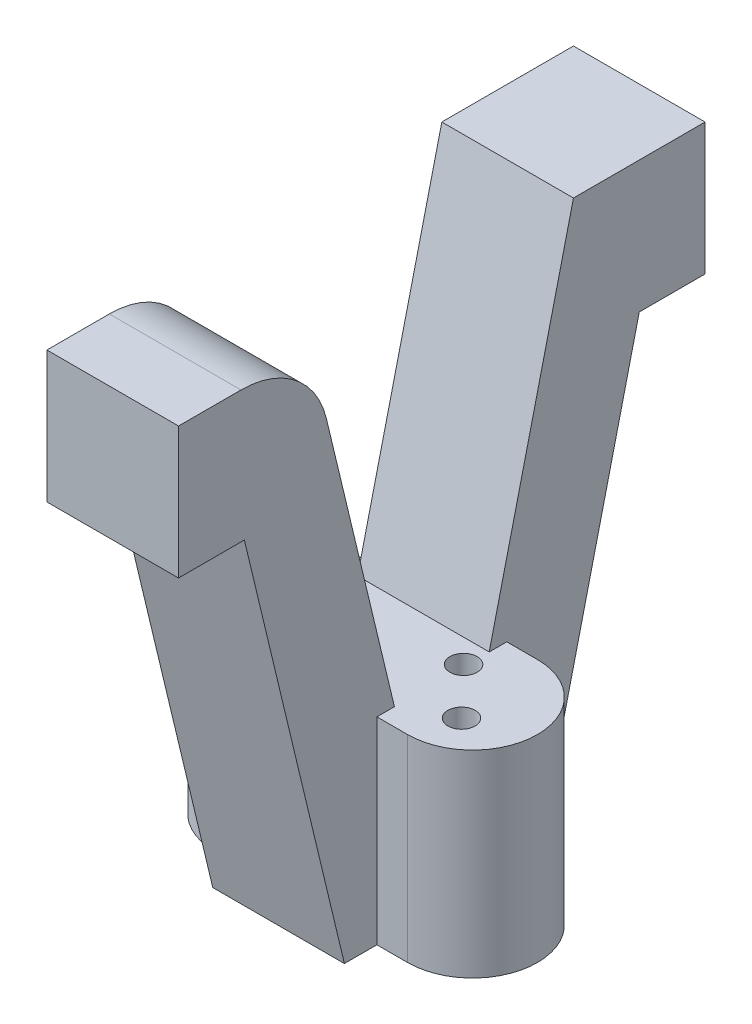
ISO-10303-21;
HEADER;
FILE_DESCRIPTION(('STEP AP214'),'2;1');
FILE_NAME('part.step','',(''),(''),'','','');
FILE_SCHEMA(('AUTOMOTIVE_DESIGN { 1 0 10303 214 1 1 1 1 }'));
ENDSEC;
DATA;
#1=APPLICATION_CONTEXT('core data for automotive mechanical design processes');
#2=APPLICATION_PROTOCOL_DEFINITION('international standard','automotive_design',2000,#1);
#3=PRODUCT_CONTEXT('',#1,'mechanical');
#4=PRODUCT('Part','Part','',(#3));
#5=PRODUCT_RELATED_PRODUCT_CATEGORY('part','',(#4));
#6=PRODUCT_DEFINITION_FORMATION('','',#4);
#7=PRODUCT_DEFINITION_CONTEXT('part definition',#1,'design');
#8=PRODUCT_DEFINITION('design','',#6,#7);
#9=PRODUCT_DEFINITION_SHAPE('','',#8);
#10=(LENGTH_UNIT() NAMED_UNIT(*) SI_UNIT(.MILLI.,.METRE.));
#11=(NAMED_UNIT(*) PLANE_ANGLE_UNIT() SI_UNIT($,.RADIAN.));
#12=(NAMED_UNIT(*) SI_UNIT($,.STERADIAN.) SOLID_ANGLE_UNIT());
#13=UNCERTAINTY_MEASURE_WITH_UNIT(LENGTH_MEASURE(1.E-05),#10,'distance_accuracy_value','');
#14=(GEOMETRIC_REPRESENTATION_CONTEXT(3) GLOBAL_UNCERTAINTY_ASSIGNED_CONTEXT((#13)) GLOBAL_UNIT_ASSIGNED_CONTEXT((#10,
#11,#12)) REPRESENTATION_CONTEXT('',''));
#15=CARTESIAN_POINT('',(0.,0.,0.));
#16=DIRECTION('',(0.,0.,1.));
#17=DIRECTION('',(1.,0.,0.));
#18=AXIS2_PLACEMENT_3D('',#15,#16,#17);
#19=CARTESIAN_POINT('',(-2.2,4.5,-1.48));
#20=DIRECTION('',(0.,0.,-1.));
#21=DIRECTION('',(-1.,0.,0.));
#22=AXIS2_PLACEMENT_3D('',#19,#20,#21);
#23=PLANE('',#22);
#24=DIRECTION('',(1.,0.,0.));
#25=VECTOR('',#24,1.);
#26=CARTESIAN_POINT('',(-2.2,0.,-1.48));
#27=LINE('',#26,#25);
#28=CARTESIAN_POINT('',(1.5,0.,-1.48));
#29=VERTEX_POINT('',#28);
#30=CARTESIAN_POINT('',(2.2,0.,-1.48));
#31=VERTEX_POINT('',#30);
#32=EDGE_CURVE('E265',#29,#31,#27,.T.);
#33=ORIENTED_EDGE('',*,*,#32,.F.);
#34=DIRECTION('',(0.,1.,0.));
#35=VECTOR('',#34,1.);
#36=CARTESIAN_POINT('',(1.5,4.5,-1.48));
#37=LINE('',#36,#35);
#38=CARTESIAN_POINT('',(1.5,4.5,-1.48));
#39=VERTEX_POINT('',#38);
#40=EDGE_CURVE('E229',#29,#39,#37,.T.);
#41=ORIENTED_EDGE('',*,*,#40,.T.);
#42=DIRECTION('',(1.,0.,0.));
#43=VECTOR('',#42,1.);
#44=CARTESIAN_POINT('',(-2.2,4.5,-1.48));
#45=LINE('',#44,#43);
#46=CARTESIAN_POINT('',(2.2,4.5,-1.48));
#47=VERTEX_POINT('',#46);
#48=EDGE_CURVE('E251',#39,#47,#45,.T.);
#49=ORIENTED_EDGE('',*,*,#48,.T.);
#50=DIRECTION('',(0.,-1.,0.));
#51=VECTOR('',#50,1.);
#52=CARTESIAN_POINT('',(2.2,4.5,-1.48));
#53=LINE('',#52,#51);
#54=EDGE_CURVE('E269',#47,#31,#53,.T.);
#55=ORIENTED_EDGE('',*,*,#54,.T.);
#56=EDGE_LOOP('',(#33,#41,#49,#55));
#57=FACE_BOUND('',#56,.T.);
#58=ADVANCED_FACE('F33',(#57),#23,.T.);
#59=CARTESIAN_POINT('',(-1.5,0.,0.));
#60=DIRECTION('',(-1.,0.,0.));
#61=DIRECTION('',(0.,0.,1.));
#62=AXIS2_PLACEMENT_3D('',#59,#60,#61);
#63=PLANE('',#62);
#64=DIRECTION('',(0.,0.,-1.));
#65=VECTOR('',#64,1.);
#66=CARTESIAN_POINT('',(-1.5,4.5,0.));
#67=LINE('',#66,#65);
#68=CARTESIAN_POINT('',(-1.5,4.5,1.48));
#69=VERTEX_POINT('',#68);
#70=CARTESIAN_POINT('',(-1.5,4.5,1.08));
#71=VERTEX_POINT('',#70);
#72=EDGE_CURVE('E58',#69,#71,#67,.T.);
#73=ORIENTED_EDGE('',*,*,#72,.F.);
#74=DIRECTION('',(0.,-1.,0.));
#75=VECTOR('',#74,1.);
#76=CARTESIAN_POINT('',(-1.5,0.,1.48));
#77=LINE('',#76,#75);
#78=CARTESIAN_POINT('',(-1.5,0.,1.48));
#79=VERTEX_POINT('',#78);
#80=EDGE_CURVE('E282',#69,#79,#77,.T.);
#81=ORIENTED_EDGE('',*,*,#80,.T.);
#82=DIRECTION('',(0.,0.,-1.));
#83=VECTOR('',#82,1.);
#84=CARTESIAN_POINT('',(-1.5,0.,0.));
#85=LINE('',#84,#83);
#86=CARTESIAN_POINT('',(-1.5,0.,2.22));
#87=VERTEX_POINT('',#86);
#88=EDGE_CURVE('E310',#87,#79,#85,.T.);
#89=ORIENTED_EDGE('',*,*,#88,.F.);
#90=DIRECTION('',(0.,-0.972387301980517,-0.233372952475324));
#91=VECTOR('',#90,1.);
#92=CARTESIAN_POINT('',(-1.5,0.,2.22));
#93=LINE('',#92,#91);
#94=CARTESIAN_POINT('',(-1.5,9.5,4.5));
#95=VERTEX_POINT('',#94);
#96=EDGE_CURVE('E307',#95,#87,#93,.T.);
#97=ORIENTED_EDGE('',*,*,#96,.F.);
#98=DIRECTION('',(0.,0.,-1.));
#99=VECTOR('',#98,1.);
#100=CARTESIAN_POINT('',(-1.5,9.5,6.));
#101=LINE('',#100,#99);
#102=CARTESIAN_POINT('',(-1.5,9.5,6.));
#103=VERTEX_POINT('',#102);
#104=EDGE_CURVE('E304',#103,#95,#101,.T.);
#105=ORIENTED_EDGE('',*,*,#104,.F.);
#106=DIRECTION('',(0.,-1.,0.));
#107=VECTOR('',#106,1.);
#108=CARTESIAN_POINT('',(-1.5,12.5,6.));
#109=LINE('',#108,#107);
#110=CARTESIAN_POINT('',(-1.5,12.5,6.));
#111=VERTEX_POINT('',#110);
#112=EDGE_CURVE('E301',#111,#103,#109,.T.);
#113=ORIENTED_EDGE('',*,*,#112,.F.);
#114=DIRECTION('',(0.,0.,1.));
#115=VECTOR('',#114,1.);
#116=CARTESIAN_POINT('',(-1.5,12.5,6.));
#117=LINE('',#116,#115);
#118=CARTESIAN_POINT('',(-1.5,12.5,4.57679362114919));
#119=VERTEX_POINT('',#118);
#120=EDGE_CURVE('E299',#119,#111,#117,.T.);
#121=ORIENTED_EDGE('',*,*,#120,.F.);
#122=CARTESIAN_POINT('',(-1.5,10.5,4.57679362114919));
#123=DIRECTION('',(-1.,0.,0.));
#124=DIRECTION('',(0.,0.,1.));
#125=AXIS2_PLACEMENT_3D('',#122,#123,#124);
#126=CIRCLE('',#125,2.);
#127=CARTESIAN_POINT('',(-1.5,10.9667459049506,2.63201901718816));
#128=VERTEX_POINT('',#127);
#129=EDGE_CURVE('E331',#119,#128,#126,.T.);
#130=ORIENTED_EDGE('',*,*,#129,.T.);
#131=DIRECTION('',(0.,0.972387301980517,0.233372952475324));
#132=VECTOR('',#131,1.);
#133=CARTESIAN_POINT('',(-1.5,12.5,3.));
#134=LINE('',#133,#132);
#135=EDGE_CURVE('E313',#71,#128,#134,.T.);
#136=ORIENTED_EDGE('',*,*,#135,.F.);
#137=EDGE_LOOP('',(#73,#81,#89,#97,#105,#113,#121,#130,#136));
#138=FACE_BOUND('',#137,.T.);
#139=ADVANCED_FACE('F379',(#138),#63,.T.);
#140=CARTESIAN_POINT('',(1.5,0.,0.));
#141=DIRECTION('',(-1.,0.,0.));
#142=DIRECTION('',(0.,0.,1.));
#143=AXIS2_PLACEMENT_3D('',#140,#141,#142);
#144=PLANE('',#143);
#145=DIRECTION('',(0.,-1.,0.));
#146=VECTOR('',#145,1.);
#147=CARTESIAN_POINT('',(1.5,0.,1.48));
#148=LINE('',#147,#146);
#149=CARTESIAN_POINT('',(1.5,4.5,1.48));
#150=VERTEX_POINT('',#149);
#151=CARTESIAN_POINT('',(1.5,0.,1.48));
#152=VERTEX_POINT('',#151);
#153=EDGE_CURVE('E336',#150,#152,#148,.T.);
#154=ORIENTED_EDGE('',*,*,#153,.F.);
#155=DIRECTION('',(0.,0.,-1.));
#156=VECTOR('',#155,1.);
#157=CARTESIAN_POINT('',(1.5,4.5,0.));
#158=LINE('',#157,#156);
#159=CARTESIAN_POINT('',(1.5,4.5,1.08));
#160=VERTEX_POINT('',#159);
#161=EDGE_CURVE('E334',#150,#160,#158,.T.);
#162=ORIENTED_EDGE('',*,*,#161,.T.);
#163=DIRECTION('',(0.,0.972387301980517,0.233372952475324));
#164=VECTOR('',#163,1.);
#165=CARTESIAN_POINT('',(1.5,12.5,3.));
#166=LINE('',#165,#164);
#167=CARTESIAN_POINT('',(1.5,10.9667459049506,2.63201901718816));
#168=VERTEX_POINT('',#167);
#169=EDGE_CURVE('E297',#160,#168,#166,.T.);
#170=ORIENTED_EDGE('',*,*,#169,.T.);
#171=CARTESIAN_POINT('',(1.5,10.5,4.57679362114919));
#172=DIRECTION('',(-1.,0.,0.));
#173=DIRECTION('',(0.,0.,1.));
#174=AXIS2_PLACEMENT_3D('',#171,#172,#173);
#175=CIRCLE('',#174,2.);
#176=CARTESIAN_POINT('',(1.5,12.5,4.57679362114919));
#177=VERTEX_POINT('',#176);
#178=EDGE_CURVE('E327',#168,#177,#175,.F.);
#179=ORIENTED_EDGE('',*,*,#178,.T.);
#180=DIRECTION('',(0.,0.,1.));
#181=VECTOR('',#180,1.);
#182=CARTESIAN_POINT('',(1.5,12.5,6.));
#183=LINE('',#182,#181);
#184=CARTESIAN_POINT('',(1.5,12.5,6.));
#185=VERTEX_POINT('',#184);
#186=EDGE_CURVE('E284',#177,#185,#183,.T.);
#187=ORIENTED_EDGE('',*,*,#186,.T.);
#188=DIRECTION('',(0.,-1.,0.));
#189=VECTOR('',#188,1.);
#190=CARTESIAN_POINT('',(1.5,12.5,6.));
#191=LINE('',#190,#189);
#192=CARTESIAN_POINT('',(1.5,9.5,6.));
#193=VERTEX_POINT('',#192);
#194=EDGE_CURVE('E286',#185,#193,#191,.T.);
#195=ORIENTED_EDGE('',*,*,#194,.T.);
#196=DIRECTION('',(0.,0.,-1.));
#197=VECTOR('',#196,1.);
#198=CARTESIAN_POINT('',(1.5,9.5,6.));
#199=LINE('',#198,#197);
#200=CARTESIAN_POINT('',(1.5,9.5,4.5));
#201=VERTEX_POINT('',#200);
#202=EDGE_CURVE('E289',#193,#201,#199,.T.);
#203=ORIENTED_EDGE('',*,*,#202,.T.);
#204=DIRECTION('',(0.,-0.972387301980517,-0.233372952475324));
#205=VECTOR('',#204,1.);
#206=CARTESIAN_POINT('',(1.5,0.,2.22));
#207=LINE('',#206,#205);
#208=CARTESIAN_POINT('',(1.5,0.,2.22));
#209=VERTEX_POINT('',#208);
#210=EDGE_CURVE('E292',#201,#209,#207,.T.);
#211=ORIENTED_EDGE('',*,*,#210,.T.);
#212=DIRECTION('',(0.,0.,-1.));
#213=VECTOR('',#212,1.);
#214=CARTESIAN_POINT('',(1.5,0.,0.));
#215=LINE('',#214,#213);
#216=EDGE_CURVE('E295',#209,#152,#215,.T.);
#217=ORIENTED_EDGE('',*,*,#216,.T.);
#218=EDGE_LOOP('',(#154,#162,#170,#179,#187,#195,#203,#211,#217));
#219=FACE_BOUND('',#218,.T.);
#220=ADVANCED_FACE('F386',(#219),#144,.F.);
#221=CARTESIAN_POINT('',(-1.5,12.5,6.));
#222=DIRECTION('',(0.,1.,0.));
#223=DIRECTION('',(0.,0.,1.));
#224=AXIS2_PLACEMENT_3D('',#221,#222,#223);
#225=PLANE('',#224);
#226=ORIENTED_EDGE('',*,*,#186,.F.);
#227=DIRECTION('',(1.,0.,0.));
#228=VECTOR('',#227,1.);
#229=CARTESIAN_POINT('',(-1.5,12.5,4.57679362114919));
#230=LINE('',#229,#228);
#231=EDGE_CURVE('E329',#177,#119,#230,.F.);
#232=ORIENTED_EDGE('',*,*,#231,.T.);
#233=ORIENTED_EDGE('',*,*,#120,.T.);
#234=DIRECTION('',(1.,0.,0.));
#235=VECTOR('',#234,1.);
#236=CARTESIAN_POINT('',(-1.5,12.5,6.));
#237=LINE('',#236,#235);
#238=EDGE_CURVE('E315',#111,#185,#237,.T.);
#239=ORIENTED_EDGE('',*,*,#238,.T.);
#240=EDGE_LOOP('',(#226,#232,#233,#239));
#241=FACE_BOUND('',#240,.T.);
#242=ADVANCED_FACE('F450',(#241),#225,.T.);
#243=CARTESIAN_POINT('',(-1.5,12.5,3.));
#244=DIRECTION('',(0.,0.233372952475324,-0.972387301980517));
#245=DIRECTION('',(0.,0.972387301980518,0.233372952475324));
#246=AXIS2_PLACEMENT_3D('',#243,#244,#245);
#247=PLANE('',#246);
#248=DIRECTION('',(1.,0.,0.));
#249=VECTOR('',#248,1.);
#250=CARTESIAN_POINT('',(-1.5,4.5,1.08));
#251=LINE('',#250,#249);
#252=EDGE_CURVE('E278',#71,#160,#251,.T.);
#253=ORIENTED_EDGE('',*,*,#252,.F.);
#254=ORIENTED_EDGE('',*,*,#135,.T.);
#255=DIRECTION('',(1.,0.,0.));
#256=VECTOR('',#255,1.);
#257=CARTESIAN_POINT('',(-1.5,10.9667459049506,2.63201901718816));
#258=LINE('',#257,#256);
#259=EDGE_CURVE('E318',#128,#168,#258,.T.);
#260=ORIENTED_EDGE('',*,*,#259,.T.);
#261=ORIENTED_EDGE('',*,*,#169,.F.);
#262=EDGE_LOOP('',(#253,#254,#260,#261));
#263=FACE_BOUND('',#262,.T.);
#264=ADVANCED_FACE('F440',(#263),#247,.T.);
#265=CARTESIAN_POINT('',(-1.5,0.,0.));
#266=DIRECTION('',(0.,-1.,0.));
#267=DIRECTION('',(0.,0.,-1.));
#268=AXIS2_PLACEMENT_3D('',#265,#266,#267);
#269=PLANE('',#268);
#270=CARTESIAN_POINT('',(-1.21081065438977,0.,0.));
#271=DIRECTION('',(0.,1.,0.));
#272=DIRECTION('',(0.,0.,1.));
#273=AXIS2_PLACEMENT_3D('',#270,#271,#272);
#274=CIRCLE('',#273,0.63);
#275=CARTESIAN_POINT('',(-1.21081065438977,0.,0.629999999999999));
#276=VERTEX_POINT('',#275);
#277=EDGE_CURVE('E344',#276,#276,#274,.T.);
#278=ORIENTED_EDGE('',*,*,#277,.T.);
#279=EDGE_LOOP('',(#278));
#280=FACE_BOUND('',#279,.T.);
#281=CARTESIAN_POINT('',(1.45353845370262,0.,-0.541981392860774));
#282=DIRECTION('',(0.,1.,0.));
#283=DIRECTION('',(0.,0.,1.));
#284=AXIS2_PLACEMENT_3D('',#281,#282,#283);
#285=CIRCLE('',#284,0.310429464597826);
#286=CARTESIAN_POINT('',(1.45353845370262,0.,-0.231551928262949));
#287=VERTEX_POINT('',#286);
#288=EDGE_CURVE('E359',#287,#287,#285,.T.);
#289=ORIENTED_EDGE('',*,*,#288,.T.);
#290=EDGE_LOOP('',(#289));
#291=FACE_BOUND('',#290,.T.);
#292=CARTESIAN_POINT('',(2.49037242265366,0.,0.541981392860775));
#293=DIRECTION('',(0.,1.,0.));
#294=DIRECTION('',(0.,0.,1.));
#295=AXIS2_PLACEMENT_3D('',#292,#293,#294);
#296=CIRCLE('',#295,0.310429464597825);
#297=CARTESIAN_POINT('',(2.49037242265366,0.,0.8524108574586));
#298=VERTEX_POINT('',#297);
#299=EDGE_CURVE('E205',#298,#298,#296,.T.);
#300=ORIENTED_EDGE('',*,*,#299,.T.);
#301=EDGE_LOOP('',(#300));
#302=FACE_BOUND('',#301,.T.);
#303=CARTESIAN_POINT('',(-2.2,0.,-1.48));
#304=VERTEX_POINT('',#303);
#305=CARTESIAN_POINT('',(-1.5,0.,-1.48));
#306=VERTEX_POINT('',#305);
#307=EDGE_CURVE('E244',#304,#306,#27,.T.);
#308=ORIENTED_EDGE('',*,*,#307,.T.);
#309=DIRECTION('',(0.,0.,1.));
#310=VECTOR('',#309,1.);
#311=CARTESIAN_POINT('',(-1.5,0.,0.));
#312=LINE('',#311,#310);
#313=CARTESIAN_POINT('',(-1.5,0.,-2.22));
#314=VERTEX_POINT('',#313);
#315=EDGE_CURVE('E220',#314,#306,#312,.T.);
#316=ORIENTED_EDGE('',*,*,#315,.F.);
#317=DIRECTION('',(1.,0.,0.));
#318=VECTOR('',#317,1.);
#319=CARTESIAN_POINT('',(-1.5,0.,-2.22));
#320=LINE('',#319,#318);
#321=CARTESIAN_POINT('',(1.5,0.,-2.22));
#322=VERTEX_POINT('',#321);
#323=EDGE_CURVE('E194',#314,#322,#320,.T.);
#324=ORIENTED_EDGE('',*,*,#323,.T.);
#325=DIRECTION('',(0.,0.,1.));
#326=VECTOR('',#325,1.);
#327=CARTESIAN_POINT('',(1.5,0.,0.));
#328=LINE('',#327,#326);
#329=EDGE_CURVE('E184',#322,#29,#328,.T.);
#330=ORIENTED_EDGE('',*,*,#329,.T.);
#331=ORIENTED_EDGE('',*,*,#32,.T.);
#332=CARTESIAN_POINT('',(2.2,0.,0.));
#333=DIRECTION('',(0.,1.,0.));
#334=DIRECTION('',(0.,0.,1.));
#335=AXIS2_PLACEMENT_3D('',#332,#333,#334);
#336=CIRCLE('',#335,1.48);
#337=CARTESIAN_POINT('',(2.2,0.,1.48));
#338=VERTEX_POINT('',#337);
#339=EDGE_CURVE('E262',#338,#31,#336,.T.);
#340=ORIENTED_EDGE('',*,*,#339,.F.);
#341=DIRECTION('',(1.,0.,0.));
#342=VECTOR('',#341,1.);
#343=CARTESIAN_POINT('',(-2.2,0.,1.48));
#344=LINE('',#343,#342);
#345=EDGE_CURVE('E258',#152,#338,#344,.T.);
#346=ORIENTED_EDGE('',*,*,#345,.F.);
#347=ORIENTED_EDGE('',*,*,#216,.F.);
#348=DIRECTION('',(1.,0.,0.));
#349=VECTOR('',#348,1.);
#350=CARTESIAN_POINT('',(-1.5,0.,2.22));
#351=LINE('',#350,#349);
#352=EDGE_CURVE('E316',#87,#209,#351,.T.);
#353=ORIENTED_EDGE('',*,*,#352,.F.);
#354=ORIENTED_EDGE('',*,*,#88,.T.);
#355=CARTESIAN_POINT('',(-2.2,0.,1.48));
#356=VERTEX_POINT('',#355);
#357=EDGE_CURVE('E259',#356,#79,#344,.T.);
#358=ORIENTED_EDGE('',*,*,#357,.F.);
#359=CARTESIAN_POINT('',(-2.2,0.,0.));
#360=DIRECTION('',(0.,1.,0.));
#361=DIRECTION('',(0.,0.,1.));
#362=AXIS2_PLACEMENT_3D('',#359,#360,#361);
#363=CIRCLE('',#362,1.48);
#364=EDGE_CURVE('E239',#304,#356,#363,.T.);
#365=ORIENTED_EDGE('',*,*,#364,.F.);
#366=EDGE_LOOP('',(#308,#316,#324,#330,#331,#340,#346,#347,#353,#354,#358,#365));
#367=FACE_BOUND('',#366,.T.);
#368=ADVANCED_FACE('F366',(#280,#291,#302,#367),#269,.T.);
#369=CARTESIAN_POINT('',(-1.5,0.,2.22));
#370=DIRECTION('',(0.,-0.233372952475324,0.972387301980517));
#371=DIRECTION('',(0.,-0.972387301980518,-0.233372952475324));
#372=AXIS2_PLACEMENT_3D('',#369,#370,#371);
#373=PLANE('',#372);
#374=ORIENTED_EDGE('',*,*,#352,.T.);
#375=ORIENTED_EDGE('',*,*,#210,.F.);
#376=DIRECTION('',(1.,0.,0.));
#377=VECTOR('',#376,1.);
#378=CARTESIAN_POINT('',(-1.5,9.5,4.5));
#379=LINE('',#378,#377);
#380=EDGE_CURVE('E319',#95,#201,#379,.T.);
#381=ORIENTED_EDGE('',*,*,#380,.F.);
#382=ORIENTED_EDGE('',*,*,#96,.T.);
#383=EDGE_LOOP('',(#374,#375,#381,#382));
#384=FACE_BOUND('',#383,.T.);
#385=ADVANCED_FACE('F462',(#384),#373,.T.);
#386=CARTESIAN_POINT('',(-1.5,9.5,6.));
#387=DIRECTION('',(0.,-1.,0.));
#388=DIRECTION('',(0.,0.,-1.));
#389=AXIS2_PLACEMENT_3D('',#386,#387,#388);
#390=PLANE('',#389);
#391=ORIENTED_EDGE('',*,*,#380,.T.);
#392=ORIENTED_EDGE('',*,*,#202,.F.);
#393=DIRECTION('',(1.,0.,0.));
#394=VECTOR('',#393,1.);
#395=CARTESIAN_POINT('',(-1.5,9.5,6.));
#396=LINE('',#395,#394);
#397=EDGE_CURVE('E321',#103,#193,#396,.T.);
#398=ORIENTED_EDGE('',*,*,#397,.F.);
#399=ORIENTED_EDGE('',*,*,#104,.T.);
#400=EDGE_LOOP('',(#391,#392,#398,#399));
#401=FACE_BOUND('',#400,.T.);
#402=ADVANCED_FACE('F458',(#401),#390,.T.);
#403=CARTESIAN_POINT('',(-1.5,12.5,6.));
#404=DIRECTION('',(0.,0.,1.));
#405=DIRECTION('',(0.,-1.,0.));
#406=AXIS2_PLACEMENT_3D('',#403,#404,#405);
#407=PLANE('',#406);
#408=ORIENTED_EDGE('',*,*,#397,.T.);
#409=ORIENTED_EDGE('',*,*,#194,.F.);
#410=ORIENTED_EDGE('',*,*,#238,.F.);
#411=ORIENTED_EDGE('',*,*,#112,.T.);
#412=EDGE_LOOP('',(#408,#409,#410,#411));
#413=FACE_BOUND('',#412,.T.);
#414=ADVANCED_FACE('F454',(#413),#407,.T.);
#415=CARTESIAN_POINT('',(-1.5,10.5,4.57679362114919));
#416=DIRECTION('',(1.,0.,0.));
#417=DIRECTION('',(0.,0.,-1.));
#418=AXIS2_PLACEMENT_3D('',#415,#416,#417);
#419=CYLINDRICAL_SURFACE('',#418,2.);
#420=ORIENTED_EDGE('',*,*,#129,.F.);
#421=ORIENTED_EDGE('',*,*,#231,.F.);
#422=ORIENTED_EDGE('',*,*,#178,.F.);
#423=ORIENTED_EDGE('',*,*,#259,.F.);
#424=EDGE_LOOP('',(#420,#421,#422,#423));
#425=FACE_BOUND('',#424,.T.);
#426=ADVANCED_FACE('F35',(#425),#419,.T.);
#427=CARTESIAN_POINT('',(-2.2,4.5,1.48));
#428=DIRECTION('',(0.,0.,-1.));
#429=DIRECTION('',(-1.,0.,0.));
#430=AXIS2_PLACEMENT_3D('',#427,#428,#429);
#431=PLANE('',#430);
#432=DIRECTION('',(1.,0.,0.));
#433=VECTOR('',#432,1.);
#434=CARTESIAN_POINT('',(-2.2,4.5,1.48));
#435=LINE('',#434,#433);
#436=CARTESIAN_POINT('',(2.2,4.5,1.48));
#437=VERTEX_POINT('',#436);
#438=EDGE_CURVE('E243',#150,#437,#435,.T.);
#439=ORIENTED_EDGE('',*,*,#438,.F.);
#440=ORIENTED_EDGE('',*,*,#153,.T.);
#441=ORIENTED_EDGE('',*,*,#345,.T.);
#442=DIRECTION('',(0.,-1.,0.));
#443=VECTOR('',#442,1.);
#444=CARTESIAN_POINT('',(2.2,4.5,1.48));
#445=LINE('',#444,#443);
#446=EDGE_CURVE('E272',#437,#338,#445,.T.);
#447=ORIENTED_EDGE('',*,*,#446,.F.);
#448=EDGE_LOOP('',(#439,#440,#441,#447));
#449=FACE_BOUND('',#448,.T.);
#450=ADVANCED_FACE('F436',(#449),#431,.F.);
#451=CARTESIAN_POINT('',(-2.2,4.5,0.));
#452=DIRECTION('',(0.,-1.,0.));
#453=DIRECTION('',(0.,0.,-1.));
#454=AXIS2_PLACEMENT_3D('',#451,#452,#453);
#455=CYLINDRICAL_SURFACE('',#454,1.48);
#456=ORIENTED_EDGE('',*,*,#364,.T.);
#457=DIRECTION('',(0.,-1.,0.));
#458=VECTOR('',#457,1.);
#459=CARTESIAN_POINT('',(-2.2,4.5,1.48));
#460=LINE('',#459,#458);
#461=CARTESIAN_POINT('',(-2.2,4.5,1.48));
#462=VERTEX_POINT('',#461);
#463=EDGE_CURVE('E275',#462,#356,#460,.T.);
#464=ORIENTED_EDGE('',*,*,#463,.F.);
#465=CARTESIAN_POINT('',(-2.2,4.5,0.));
#466=DIRECTION('',(0.,1.,0.));
#467=DIRECTION('',(0.,0.,1.));
#468=AXIS2_PLACEMENT_3D('',#465,#466,#467);
#469=CIRCLE('',#468,1.48);
#470=CARTESIAN_POINT('',(-2.2,4.5,-1.48));
#471=VERTEX_POINT('',#470);
#472=EDGE_CURVE('E240',#471,#462,#469,.T.);
#473=ORIENTED_EDGE('',*,*,#472,.F.);
#474=DIRECTION('',(0.,-1.,0.));
#475=VECTOR('',#474,1.);
#476=CARTESIAN_POINT('',(-2.2,4.5,-1.48));
#477=LINE('',#476,#475);
#478=EDGE_CURVE('E255',#471,#304,#477,.T.);
#479=ORIENTED_EDGE('',*,*,#478,.T.);
#480=EDGE_LOOP('',(#456,#464,#473,#479));
#481=FACE_BOUND('',#480,.T.);
#482=ADVANCED_FACE('F410',(#481),#455,.T.);
#483=ORIENTED_EDGE('',*,*,#80,.F.);
#484=EDGE_CURVE('E245',#462,#69,#435,.T.);
#485=ORIENTED_EDGE('',*,*,#484,.F.);
#486=ORIENTED_EDGE('',*,*,#463,.T.);
#487=ORIENTED_EDGE('',*,*,#357,.T.);
#488=EDGE_LOOP('',(#483,#485,#486,#487));
#489=FACE_BOUND('',#488,.T.);
#490=ADVANCED_FACE('F399',(#489),#431,.F.);
#491=CARTESIAN_POINT('',(2.2,4.5,0.));
#492=DIRECTION('',(0.,-1.,0.));
#493=DIRECTION('',(0.,0.,-1.));
#494=AXIS2_PLACEMENT_3D('',#491,#492,#493);
#495=CYLINDRICAL_SURFACE('',#494,1.48);
#496=ORIENTED_EDGE('',*,*,#339,.T.);
#497=ORIENTED_EDGE('',*,*,#54,.F.);
#498=CARTESIAN_POINT('',(2.2,4.5,0.));
#499=DIRECTION('',(0.,1.,0.));
#500=DIRECTION('',(0.,0.,1.));
#501=AXIS2_PLACEMENT_3D('',#498,#499,#500);
#502=CIRCLE('',#501,1.48);
#503=EDGE_CURVE('E248',#437,#47,#502,.T.);
#504=ORIENTED_EDGE('',*,*,#503,.F.);
#505=ORIENTED_EDGE('',*,*,#446,.T.);
#506=EDGE_LOOP('',(#496,#497,#504,#505));
#507=FACE_BOUND('',#506,.T.);
#508=ADVANCED_FACE('F392',(#507),#495,.T.);
#509=DIRECTION('',(0.,1.,0.));
#510=VECTOR('',#509,1.);
#511=CARTESIAN_POINT('',(-1.5,4.5,-1.48));
#512=LINE('',#511,#510);
#513=CARTESIAN_POINT('',(-1.5,4.5,-1.48));
#514=VERTEX_POINT('',#513);
#515=EDGE_CURVE('E237',#306,#514,#512,.T.);
#516=ORIENTED_EDGE('',*,*,#515,.F.);
#517=ORIENTED_EDGE('',*,*,#307,.F.);
#518=ORIENTED_EDGE('',*,*,#478,.F.);
#519=EDGE_CURVE('E252',#471,#514,#45,.T.);
#520=ORIENTED_EDGE('',*,*,#519,.T.);
#521=EDGE_LOOP('',(#516,#517,#518,#520));
#522=FACE_BOUND('',#521,.T.);
#523=ADVANCED_FACE('F382',(#522),#23,.T.);
#524=CARTESIAN_POINT('',(-2.2,4.5,0.));
#525=DIRECTION('',(0.,1.,0.));
#526=DIRECTION('',(0.,0.,1.));
#527=AXIS2_PLACEMENT_3D('',#524,#525,#526);
#528=PLANE('',#527);
#529=CARTESIAN_POINT('',(-1.21081065438977,4.5,0.));
#530=DIRECTION('',(0.,1.,0.));
#531=DIRECTION('',(0.,0.,1.));
#532=AXIS2_PLACEMENT_3D('',#529,#530,#531);
#533=CIRCLE('',#532,0.63);
#534=CARTESIAN_POINT('',(-1.21081065438977,4.5,0.629999999999999));
#535=VERTEX_POINT('',#534);
#536=EDGE_CURVE('E37',#535,#535,#533,.F.);
#537=ORIENTED_EDGE('',*,*,#536,.T.);
#538=EDGE_LOOP('',(#537));
#539=FACE_BOUND('',#538,.T.);
#540=CARTESIAN_POINT('',(1.45353845370262,4.5,-0.541981392860774));
#541=DIRECTION('',(0.,1.,0.));
#542=DIRECTION('',(0.,0.,1.));
#543=AXIS2_PLACEMENT_3D('',#540,#541,#542);
#544=CIRCLE('',#543,0.310429464597826);
#545=CARTESIAN_POINT('',(1.45353845370262,4.5,-0.231551928262949));
#546=VERTEX_POINT('',#545);
#547=EDGE_CURVE('E203',#546,#546,#544,.F.);
#548=ORIENTED_EDGE('',*,*,#547,.T.);
#549=EDGE_LOOP('',(#548));
#550=FACE_BOUND('',#549,.T.);
#551=CARTESIAN_POINT('',(2.49037242265366,4.5,0.541981392860775));
#552=DIRECTION('',(0.,1.,0.));
#553=DIRECTION('',(0.,0.,1.));
#554=AXIS2_PLACEMENT_3D('',#551,#552,#553);
#555=CIRCLE('',#554,0.310429464597825);
#556=CARTESIAN_POINT('',(2.49037242265366,4.5,0.8524108574586));
#557=VERTEX_POINT('',#556);
#558=EDGE_CURVE('E342',#557,#557,#555,.F.);
#559=ORIENTED_EDGE('',*,*,#558,.T.);
#560=EDGE_LOOP('',(#559));
#561=FACE_BOUND('',#560,.T.);
#562=DIRECTION('',(0.,0.,1.));
#563=VECTOR('',#562,1.);
#564=CARTESIAN_POINT('',(-1.5,4.5,0.));
#565=LINE('',#564,#563);
#566=CARTESIAN_POINT('',(-1.5,4.5,-1.08));
#567=VERTEX_POINT('',#566);
#568=EDGE_CURVE('E11',#514,#567,#565,.T.);
#569=ORIENTED_EDGE('',*,*,#568,.F.);
#570=ORIENTED_EDGE('',*,*,#519,.F.);
#571=ORIENTED_EDGE('',*,*,#472,.T.);
#572=ORIENTED_EDGE('',*,*,#484,.T.);
#573=ORIENTED_EDGE('',*,*,#72,.T.);
#574=ORIENTED_EDGE('',*,*,#252,.T.);
#575=ORIENTED_EDGE('',*,*,#161,.F.);
#576=ORIENTED_EDGE('',*,*,#438,.T.);
#577=ORIENTED_EDGE('',*,*,#503,.T.);
#578=ORIENTED_EDGE('',*,*,#48,.F.);
#579=DIRECTION('',(0.,0.,1.));
#580=VECTOR('',#579,1.);
#581=CARTESIAN_POINT('',(1.5,4.5,0.));
#582=LINE('',#581,#580);
#583=CARTESIAN_POINT('',(1.5,4.5,-1.08));
#584=VERTEX_POINT('',#583);
#585=EDGE_CURVE('E339',#39,#584,#582,.T.);
#586=ORIENTED_EDGE('',*,*,#585,.T.);
#587=DIRECTION('',(-1.,0.,0.));
#588=VECTOR('',#587,1.);
#589=CARTESIAN_POINT('',(-2.2,4.5,-1.08));
#590=LINE('',#589,#588);
#591=EDGE_CURVE('E42',#584,#567,#590,.T.);
#592=ORIENTED_EDGE('',*,*,#591,.T.);
#593=EDGE_LOOP('',(#569,#570,#571,#572,#573,#574,#575,#576,#577,#578,#586,#592));
#594=FACE_BOUND('',#593,.T.);
#595=ADVANCED_FACE('F348',(#539,#550,#561,#594),#528,.T.);
#596=CARTESIAN_POINT('',(-1.5,12.5,-6.));
#597=DIRECTION('',(0.,-1.,0.));
#598=DIRECTION('',(0.,0.,-1.));
#599=AXIS2_PLACEMENT_3D('',#596,#597,#598);
#600=PLANE('',#599);
#601=DIRECTION('',(1.,0.,0.));
#602=VECTOR('',#601,1.);
#603=CARTESIAN_POINT('',(-1.5,12.5,-3.));
#604=LINE('',#603,#602);
#605=CARTESIAN_POINT('',(-1.5,12.5,-3.));
#606=VERTEX_POINT('',#605);
#607=CARTESIAN_POINT('',(1.5,12.5,-3.));
#608=VERTEX_POINT('',#607);
#609=EDGE_CURVE('E180',#606,#608,#604,.T.);
#610=ORIENTED_EDGE('',*,*,#609,.T.);
#611=DIRECTION('',(0.,0.,-1.));
#612=VECTOR('',#611,1.);
#613=CARTESIAN_POINT('',(1.5,12.5,-6.));
#614=LINE('',#613,#612);
#615=CARTESIAN_POINT('',(1.5,12.5,-6.));
#616=VERTEX_POINT('',#615);
#617=EDGE_CURVE('E185',#608,#616,#614,.T.);
#618=ORIENTED_EDGE('',*,*,#617,.T.);
#619=DIRECTION('',(1.,0.,0.));
#620=VECTOR('',#619,1.);
#621=CARTESIAN_POINT('',(-1.5,12.5,-6.));
#622=LINE('',#621,#620);
#623=CARTESIAN_POINT('',(-1.5,12.5,-6.));
#624=VERTEX_POINT('',#623);
#625=EDGE_CURVE('E227',#624,#616,#622,.T.);
#626=ORIENTED_EDGE('',*,*,#625,.F.);
#627=DIRECTION('',(0.,0.,-1.));
#628=VECTOR('',#627,1.);
#629=CARTESIAN_POINT('',(-1.5,12.5,-6.));
#630=LINE('',#629,#628);
#631=EDGE_CURVE('E193',#606,#624,#630,.T.);
#632=ORIENTED_EDGE('',*,*,#631,.F.);
#633=EDGE_LOOP('',(#610,#618,#626,#632));
#634=FACE_BOUND('',#633,.T.);
#635=ADVANCED_FACE('F189',(#634),#600,.F.);
#636=CARTESIAN_POINT('',(-1.5,12.5,-6.));
#637=DIRECTION('',(0.,0.,1.));
#638=DIRECTION('',(0.,-1.,0.));
#639=AXIS2_PLACEMENT_3D('',#636,#637,#638);
#640=PLANE('',#639);
#641=ORIENTED_EDGE('',*,*,#625,.T.);
#642=DIRECTION('',(0.,-1.,0.));
#643=VECTOR('',#642,1.);
#644=CARTESIAN_POINT('',(1.5,12.5,-6.));
#645=LINE('',#644,#643);
#646=CARTESIAN_POINT('',(1.5,9.5,-6.));
#647=VERTEX_POINT('',#646);
#648=EDGE_CURVE('E200',#616,#647,#645,.T.);
#649=ORIENTED_EDGE('',*,*,#648,.T.);
#650=DIRECTION('',(1.,0.,0.));
#651=VECTOR('',#650,1.);
#652=CARTESIAN_POINT('',(-1.5,9.5,-6.));
#653=LINE('',#652,#651);
#654=CARTESIAN_POINT('',(-1.5,9.5,-6.));
#655=VERTEX_POINT('',#654);
#656=EDGE_CURVE('E230',#655,#647,#653,.T.);
#657=ORIENTED_EDGE('',*,*,#656,.F.);
#658=DIRECTION('',(0.,-1.,0.));
#659=VECTOR('',#658,1.);
#660=CARTESIAN_POINT('',(-1.5,12.5,-6.));
#661=LINE('',#660,#659);
#662=EDGE_CURVE('E195',#624,#655,#661,.T.);
#663=ORIENTED_EDGE('',*,*,#662,.F.);
#664=EDGE_LOOP('',(#641,#649,#657,#663));
#665=FACE_BOUND('',#664,.T.);
#666=ADVANCED_FACE('F415',(#665),#640,.F.);
#667=CARTESIAN_POINT('',(-1.5,9.5,-6.));
#668=DIRECTION('',(0.,1.,0.));
#669=DIRECTION('',(0.,0.,1.));
#670=AXIS2_PLACEMENT_3D('',#667,#668,#669);
#671=PLANE('',#670);
#672=ORIENTED_EDGE('',*,*,#656,.T.);
#673=DIRECTION('',(0.,0.,1.));
#674=VECTOR('',#673,1.);
#675=CARTESIAN_POINT('',(1.5,9.5,-6.));
#676=LINE('',#675,#674);
#677=CARTESIAN_POINT('',(1.5,9.5,-4.5));
#678=VERTEX_POINT('',#677);
#679=EDGE_CURVE('E213',#647,#678,#676,.T.);
#680=ORIENTED_EDGE('',*,*,#679,.T.);
#681=DIRECTION('',(1.,0.,0.));
#682=VECTOR('',#681,1.);
#683=CARTESIAN_POINT('',(-1.5,9.5,-4.5));
#684=LINE('',#683,#682);
#685=CARTESIAN_POINT('',(-1.5,9.5,-4.5));
#686=VERTEX_POINT('',#685);
#687=EDGE_CURVE('E232',#686,#678,#684,.T.);
#688=ORIENTED_EDGE('',*,*,#687,.F.);
#689=DIRECTION('',(0.,0.,1.));
#690=VECTOR('',#689,1.);
#691=CARTESIAN_POINT('',(-1.5,9.5,-6.));
#692=LINE('',#691,#690);
#693=EDGE_CURVE('E224',#655,#686,#692,.T.);
#694=ORIENTED_EDGE('',*,*,#693,.F.);
#695=EDGE_LOOP('',(#672,#680,#688,#694));
#696=FACE_BOUND('',#695,.T.);
#697=ADVANCED_FACE('F419',(#696),#671,.F.);
#698=CARTESIAN_POINT('',(-1.5,0.,-2.22));
#699=DIRECTION('',(0.,0.233372952475324,0.972387301980517));
#700=DIRECTION('',(0.,-0.972387301980518,0.233372952475324));
#701=AXIS2_PLACEMENT_3D('',#698,#699,#700);
#702=PLANE('',#701);
#703=ORIENTED_EDGE('',*,*,#687,.T.);
#704=DIRECTION('',(0.,-0.972387301980517,0.233372952475324));
#705=VECTOR('',#704,1.);
#706=CARTESIAN_POINT('',(1.5,0.,-2.22));
#707=LINE('',#706,#705);
#708=EDGE_CURVE('E210',#678,#322,#707,.T.);
#709=ORIENTED_EDGE('',*,*,#708,.T.);
#710=ORIENTED_EDGE('',*,*,#323,.F.);
#711=DIRECTION('',(0.,-0.972387301980517,0.233372952475324));
#712=VECTOR('',#711,1.);
#713=CARTESIAN_POINT('',(-1.5,0.,-2.22));
#714=LINE('',#713,#712);
#715=EDGE_CURVE('E222',#686,#314,#714,.T.);
#716=ORIENTED_EDGE('',*,*,#715,.F.);
#717=EDGE_LOOP('',(#703,#709,#710,#716));
#718=FACE_BOUND('',#717,.T.);
#719=ADVANCED_FACE('F423',(#718),#702,.F.);
#720=CARTESIAN_POINT('',(-1.5,12.5,-3.));
#721=DIRECTION('',(0.,-0.233372952475324,-0.972387301980517));
#722=DIRECTION('',(0.,0.972387301980518,-0.233372952475324));
#723=AXIS2_PLACEMENT_3D('',#720,#721,#722);
#724=PLANE('',#723);
#725=ORIENTED_EDGE('',*,*,#591,.F.);
#726=DIRECTION('',(0.,0.972387301980517,-0.233372952475324));
#727=VECTOR('',#726,1.);
#728=CARTESIAN_POINT('',(1.5,12.5,-3.));
#729=LINE('',#728,#727);
#730=EDGE_CURVE('E50',#584,#608,#729,.T.);
#731=ORIENTED_EDGE('',*,*,#730,.T.);
#732=ORIENTED_EDGE('',*,*,#609,.F.);
#733=DIRECTION('',(0.,0.972387301980517,-0.233372952475324));
#734=VECTOR('',#733,1.);
#735=CARTESIAN_POINT('',(-1.5,12.5,-3.));
#736=LINE('',#735,#734);
#737=EDGE_CURVE('E218',#567,#606,#736,.T.);
#738=ORIENTED_EDGE('',*,*,#737,.F.);
#739=EDGE_LOOP('',(#725,#731,#732,#738));
#740=FACE_BOUND('',#739,.T.);
#741=ADVANCED_FACE('F178',(#740),#724,.F.);
#742=CARTESIAN_POINT('',(-1.5,0.,0.));
#743=DIRECTION('',(-1.,0.,0.));
#744=DIRECTION('',(0.,0.,-1.));
#745=AXIS2_PLACEMENT_3D('',#742,#743,#744);
#746=PLANE('',#745);
#747=ORIENTED_EDGE('',*,*,#315,.T.);
#748=ORIENTED_EDGE('',*,*,#515,.T.);
#749=ORIENTED_EDGE('',*,*,#568,.T.);
#750=ORIENTED_EDGE('',*,*,#737,.T.);
#751=ORIENTED_EDGE('',*,*,#631,.T.);
#752=ORIENTED_EDGE('',*,*,#662,.T.);
#753=ORIENTED_EDGE('',*,*,#693,.T.);
#754=ORIENTED_EDGE('',*,*,#715,.T.);
#755=EDGE_LOOP('',(#747,#748,#749,#750,#751,#752,#753,#754));
#756=FACE_BOUND('',#755,.T.);
#757=ADVANCED_FACE('F375',(#756),#746,.T.);
#758=CARTESIAN_POINT('',(1.5,0.,0.));
#759=DIRECTION('',(-1.,0.,0.));
#760=DIRECTION('',(0.,0.,-1.));
#761=AXIS2_PLACEMENT_3D('',#758,#759,#760);
#762=PLANE('',#761);
#763=ORIENTED_EDGE('',*,*,#40,.F.);
#764=ORIENTED_EDGE('',*,*,#329,.F.);
#765=ORIENTED_EDGE('',*,*,#708,.F.);
#766=ORIENTED_EDGE('',*,*,#679,.F.);
#767=ORIENTED_EDGE('',*,*,#648,.F.);
#768=ORIENTED_EDGE('',*,*,#617,.F.);
#769=ORIENTED_EDGE('',*,*,#730,.F.);
#770=ORIENTED_EDGE('',*,*,#585,.F.);
#771=EDGE_LOOP('',(#763,#764,#765,#766,#767,#768,#769,#770));
#772=FACE_BOUND('',#771,.T.);
#773=ADVANCED_FACE('F197',(#772),#762,.F.);
#774=CARTESIAN_POINT('',(2.49037242265366,12.5,0.541981392860775));
#775=DIRECTION('',(0.,-1.,0.));
#776=DIRECTION('',(0.,0.,-1.));
#777=AXIS2_PLACEMENT_3D('',#774,#775,#776);
#778=CYLINDRICAL_SURFACE('',#777,0.310429464597825);
#779=ORIENTED_EDGE('',*,*,#558,.F.);
#780=EDGE_LOOP('',(#779));
#781=FACE_BOUND('',#780,.T.);
#782=ORIENTED_EDGE('',*,*,#299,.F.);
#783=EDGE_LOOP('',(#782));
#784=FACE_BOUND('',#783,.T.);
#785=ADVANCED_FACE('F355',(#781,#784),#778,.F.);
#786=CARTESIAN_POINT('',(1.45353845370262,12.5,-0.541981392860774));
#787=DIRECTION('',(0.,-1.,0.));
#788=DIRECTION('',(0.,0.,-1.));
#789=AXIS2_PLACEMENT_3D('',#786,#787,#788);
#790=CYLINDRICAL_SURFACE('',#789,0.310429464597826);
#791=ORIENTED_EDGE('',*,*,#547,.F.);
#792=EDGE_LOOP('',(#791));
#793=FACE_BOUND('',#792,.T.);
#794=ORIENTED_EDGE('',*,*,#288,.F.);
#795=EDGE_LOOP('',(#794));
#796=FACE_BOUND('',#795,.T.);
#797=ADVANCED_FACE('F351',(#793,#796),#790,.F.);
#798=CARTESIAN_POINT('',(-1.21081065438977,12.5,0.));
#799=DIRECTION('',(0.,-1.,0.));
#800=DIRECTION('',(0.,0.,-1.));
#801=AXIS2_PLACEMENT_3D('',#798,#799,#800);
#802=CYLINDRICAL_SURFACE('',#801,0.63);
#803=ORIENTED_EDGE('',*,*,#536,.F.);
#804=EDGE_LOOP('',(#803));
#805=FACE_BOUND('',#804,.T.);
#806=ORIENTED_EDGE('',*,*,#277,.F.);
#807=EDGE_LOOP('',(#806));
#808=FACE_BOUND('',#807,.T.);
#809=ADVANCED_FACE('F354',(#805,#808),#802,.F.);
#810=CLOSED_SHELL('',(#58,#139,#220,#242,#264,#368,#385,#402,#414,#426,#450,#482,#490,#508,#523,
#595,#635,#666,#697,#719,#741,#757,#773,#785,#797,#809));
#811=MANIFOLD_SOLID_BREP('B2',#810);
#812=ADVANCED_BREP_SHAPE_REPRESENTATION('',(#18,#811),#14);
#813=SHAPE_DEFINITION_REPRESENTATION(#9,#812);
ENDSEC;
END-ISO-10303-21;
